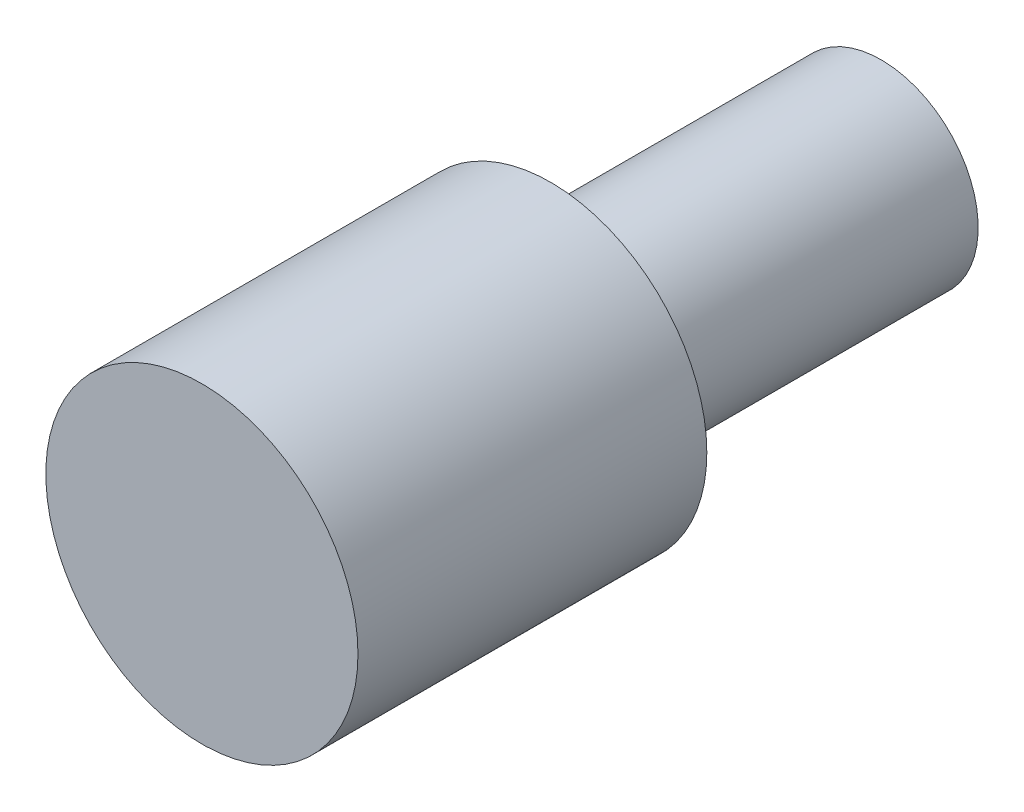
ISO-10303-21;
HEADER;
FILE_DESCRIPTION(('STEP AP214'),'2;1');
FILE_NAME('part.step','',(''),(''),'','','');
FILE_SCHEMA(('AUTOMOTIVE_DESIGN { 1 0 10303 214 1 1 1 1 }'));
ENDSEC;
DATA;
#1=APPLICATION_CONTEXT('core data for automotive mechanical design processes');
#2=APPLICATION_PROTOCOL_DEFINITION('international standard','automotive_design',2000,#1);
#3=PRODUCT_CONTEXT('',#1,'mechanical');
#4=PRODUCT('Part','Part','',(#3));
#5=PRODUCT_RELATED_PRODUCT_CATEGORY('part','',(#4));
#6=PRODUCT_DEFINITION_FORMATION('','',#4);
#7=PRODUCT_DEFINITION_CONTEXT('part definition',#1,'design');
#8=PRODUCT_DEFINITION('design','',#6,#7);
#9=PRODUCT_DEFINITION_SHAPE('','',#8);
#10=(LENGTH_UNIT() NAMED_UNIT(*) SI_UNIT(.MILLI.,.METRE.));
#11=(NAMED_UNIT(*) PLANE_ANGLE_UNIT() SI_UNIT($,.RADIAN.));
#12=(NAMED_UNIT(*) SI_UNIT($,.STERADIAN.) SOLID_ANGLE_UNIT());
#13=UNCERTAINTY_MEASURE_WITH_UNIT(LENGTH_MEASURE(1.E-05),#10,'distance_accuracy_value','');
#14=(GEOMETRIC_REPRESENTATION_CONTEXT(3) GLOBAL_UNCERTAINTY_ASSIGNED_CONTEXT((#13)) GLOBAL_UNIT_ASSIGNED_CONTEXT((#10,
#11,#12)) REPRESENTATION_CONTEXT('',''));
#15=CARTESIAN_POINT('',(0.,0.,0.));
#16=DIRECTION('',(0.,0.,1.));
#17=DIRECTION('',(1.,0.,0.));
#18=AXIS2_PLACEMENT_3D('',#15,#16,#17);
#19=CARTESIAN_POINT('',(0.,0.,17.1));
#20=DIRECTION('',(0.,0.,-1.));
#21=DIRECTION('',(-1.,0.,0.));
#22=AXIS2_PLACEMENT_3D('',#19,#20,#21);
#23=CYLINDRICAL_SURFACE('',#22,7.65);
#24=CARTESIAN_POINT('',(0.,0.,17.1));
#25=DIRECTION('',(0.,0.,1.));
#26=DIRECTION('',(1.,0.,0.));
#27=AXIS2_PLACEMENT_3D('',#24,#25,#26);
#28=CIRCLE('',#27,7.65);
#29=CARTESIAN_POINT('',(7.65,0.,17.1));
#30=VERTEX_POINT('',#29);
#31=EDGE_CURVE('E38',#30,#30,#28,.T.);
#32=ORIENTED_EDGE('',*,*,#31,.F.);
#33=EDGE_LOOP('',(#32));
#34=FACE_BOUND('',#33,.T.);
#35=CARTESIAN_POINT('',(0.,0.,0.));
#36=DIRECTION('',(0.,0.,1.));
#37=DIRECTION('',(1.,0.,0.));
#38=AXIS2_PLACEMENT_3D('',#35,#36,#37);
#39=CIRCLE('',#38,7.65);
#40=CARTESIAN_POINT('',(7.65,0.,0.));
#41=VERTEX_POINT('',#40);
#42=EDGE_CURVE('E34',#41,#41,#39,.T.);
#43=ORIENTED_EDGE('',*,*,#42,.T.);
#44=EDGE_LOOP('',(#43));
#45=FACE_BOUND('',#44,.T.);
#46=ADVANCED_FACE('F31',(#34,#45),#23,.T.);
#47=CARTESIAN_POINT('',(0.,0.,17.1));
#48=DIRECTION('',(0.,0.,1.));
#49=DIRECTION('',(1.,0.,0.));
#50=AXIS2_PLACEMENT_3D('',#47,#48,#49);
#51=PLANE('',#50);
#52=ORIENTED_EDGE('',*,*,#31,.T.);
#53=EDGE_LOOP('',(#52));
#54=FACE_BOUND('',#53,.T.);
#55=ADVANCED_FACE('F75',(#54),#51,.T.);
#56=CARTESIAN_POINT('',(0.,0.,0.));
#57=DIRECTION('',(0.,0.,1.));
#58=DIRECTION('',(1.,0.,0.));
#59=AXIS2_PLACEMENT_3D('',#56,#57,#58);
#60=PLANE('',#59);
#61=CARTESIAN_POINT('',(0.,0.,0.));
#62=DIRECTION('',(0.,0.,-1.));
#63=DIRECTION('',(-1.,0.,0.));
#64=AXIS2_PLACEMENT_3D('',#61,#62,#63);
#65=CIRCLE('',#64,4.75);
#66=CARTESIAN_POINT('',(-4.75,0.,0.));
#67=VERTEX_POINT('',#66);
#68=EDGE_CURVE('E10',#67,#67,#65,.T.);
#69=ORIENTED_EDGE('',*,*,#68,.F.);
#70=EDGE_LOOP('',(#69));
#71=FACE_BOUND('',#70,.T.);
#72=ORIENTED_EDGE('',*,*,#42,.F.);
#73=EDGE_LOOP('',(#72));
#74=FACE_BOUND('',#73,.T.);
#75=ADVANCED_FACE('F70',(#71,#74),#60,.F.);
#76=CARTESIAN_POINT('',(0.,0.,-16.2));
#77=DIRECTION('',(0.,0.,1.));
#78=DIRECTION('',(1.,0.,0.));
#79=AXIS2_PLACEMENT_3D('',#76,#77,#78);
#80=CYLINDRICAL_SURFACE('',#79,4.75);
#81=CARTESIAN_POINT('',(0.,0.,-16.2));
#82=DIRECTION('',(0.,0.,-1.));
#83=DIRECTION('',(-1.,0.,0.));
#84=AXIS2_PLACEMENT_3D('',#81,#82,#83);
#85=CIRCLE('',#84,4.75);
#86=CARTESIAN_POINT('',(-4.75,0.,-16.2));
#87=VERTEX_POINT('',#86);
#88=EDGE_CURVE('E44',#87,#87,#85,.T.);
#89=ORIENTED_EDGE('',*,*,#88,.F.);
#90=EDGE_LOOP('',(#89));
#91=FACE_BOUND('',#90,.T.);
#92=ORIENTED_EDGE('',*,*,#68,.T.);
#93=EDGE_LOOP('',(#92));
#94=FACE_BOUND('',#93,.T.);
#95=ADVANCED_FACE('F65',(#91,#94),#80,.T.);
#96=CARTESIAN_POINT('',(0.,0.,-16.2));
#97=DIRECTION('',(0.,0.,-1.));
#98=DIRECTION('',(-1.,0.,0.));
#99=AXIS2_PLACEMENT_3D('',#96,#97,#98);
#100=PLANE('',#99);
#101=CARTESIAN_POINT('',(0.,0.,-16.2));
#102=DIRECTION('',(0.,0.,-1.));
#103=DIRECTION('',(-1.,0.,0.));
#104=AXIS2_PLACEMENT_3D('',#101,#102,#103);
#105=CIRCLE('',#104,3.5);
#106=CARTESIAN_POINT('',(-3.5,0.,-16.2));
#107=VERTEX_POINT('',#106);
#108=EDGE_CURVE('E48',#107,#107,#105,.T.);
#109=ORIENTED_EDGE('',*,*,#108,.F.);
#110=EDGE_LOOP('',(#109));
#111=FACE_BOUND('',#110,.T.);
#112=ORIENTED_EDGE('',*,*,#88,.T.);
#113=EDGE_LOOP('',(#112));
#114=FACE_BOUND('',#113,.T.);
#115=ADVANCED_FACE('F59',(#111,#114),#100,.T.);
#116=CARTESIAN_POINT('',(0.,0.,0.));
#117=DIRECTION('',(0.,0.,-1.));
#118=DIRECTION('',(-1.,0.,0.));
#119=AXIS2_PLACEMENT_3D('',#116,#117,#118);
#120=CYLINDRICAL_SURFACE('',#119,3.5);
#121=CARTESIAN_POINT('',(0.,0.,0.));
#122=DIRECTION('',(0.,0.,-1.));
#123=DIRECTION('',(-1.,0.,0.));
#124=AXIS2_PLACEMENT_3D('',#121,#122,#123);
#125=CIRCLE('',#124,3.5);
#126=CARTESIAN_POINT('',(-3.5,0.,0.));
#127=VERTEX_POINT('',#126);
#128=EDGE_CURVE('E47',#127,#127,#125,.T.);
#129=ORIENTED_EDGE('',*,*,#128,.F.);
#130=EDGE_LOOP('',(#129));
#131=FACE_BOUND('',#130,.T.);
#132=ORIENTED_EDGE('',*,*,#108,.T.);
#133=EDGE_LOOP('',(#132));
#134=FACE_BOUND('',#133,.T.);
#135=ADVANCED_FACE('F56',(#131,#134),#120,.F.);
#136=CARTESIAN_POINT('',(0.,0.,0.));
#137=DIRECTION('',(0.,0.,-1.));
#138=DIRECTION('',(-1.,0.,0.));
#139=AXIS2_PLACEMENT_3D('',#136,#137,#138);
#140=PLANE('',#139);
#141=ORIENTED_EDGE('',*,*,#128,.T.);
#142=EDGE_LOOP('',(#141));
#143=FACE_BOUND('',#142,.T.);
#144=ADVANCED_FACE('F54',(#143),#140,.T.);
#145=CLOSED_SHELL('',(#46,#55,#75,#95,#115,#135,#144));
#146=MANIFOLD_SOLID_BREP('B2',#145);
#147=ADVANCED_BREP_SHAPE_REPRESENTATION('',(#18,#146),#14);
#148=SHAPE_DEFINITION_REPRESENTATION(#9,#147);
ENDSEC;
END-ISO-10303-21;
